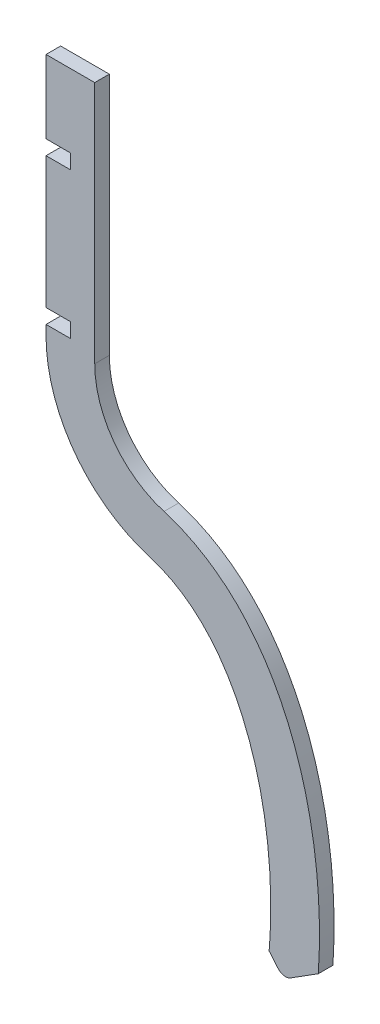
ISO-10303-21;
HEADER;
FILE_DESCRIPTION(('STEP AP214'),'2;1');
FILE_NAME('part.step','',(''),(''),'','','');
FILE_SCHEMA(('AUTOMOTIVE_DESIGN { 1 0 10303 214 1 1 1 1 }'));
ENDSEC;
DATA;
#1=APPLICATION_CONTEXT('core data for automotive mechanical design processes');
#2=APPLICATION_PROTOCOL_DEFINITION('international standard','automotive_design',2000,#1);
#3=PRODUCT_CONTEXT('',#1,'mechanical');
#4=PRODUCT('Part','Part','',(#3));
#5=PRODUCT_RELATED_PRODUCT_CATEGORY('part','',(#4));
#6=PRODUCT_DEFINITION_FORMATION('','',#4);
#7=PRODUCT_DEFINITION_CONTEXT('part definition',#1,'design');
#8=PRODUCT_DEFINITION('design','',#6,#7);
#9=PRODUCT_DEFINITION_SHAPE('','',#8);
#10=(LENGTH_UNIT() NAMED_UNIT(*) SI_UNIT(.MILLI.,.METRE.));
#11=(NAMED_UNIT(*) PLANE_ANGLE_UNIT() SI_UNIT($,.RADIAN.));
#12=(NAMED_UNIT(*) SI_UNIT($,.STERADIAN.) SOLID_ANGLE_UNIT());
#13=UNCERTAINTY_MEASURE_WITH_UNIT(LENGTH_MEASURE(1.E-05),#10,'distance_accuracy_value','');
#14=(GEOMETRIC_REPRESENTATION_CONTEXT(3) GLOBAL_UNCERTAINTY_ASSIGNED_CONTEXT((#13)) GLOBAL_UNIT_ASSIGNED_CONTEXT((#10,
#11,#12)) REPRESENTATION_CONTEXT('',''));
#15=CARTESIAN_POINT('',(0.,0.,0.));
#16=DIRECTION('',(0.,0.,1.));
#17=DIRECTION('',(1.,0.,0.));
#18=AXIS2_PLACEMENT_3D('',#15,#16,#17);
#19=CARTESIAN_POINT('',(30.2472330755642,111.105178128736,3.));
#20=DIRECTION('',(1.,0.,0.));
#21=DIRECTION('',(0.,1.,0.));
#22=AXIS2_PLACEMENT_3D('',#19,#20,#21);
#23=PLANE('',#22);
#24=DIRECTION('',(0.,0.,1.));
#25=VECTOR('',#24,1.);
#26=CARTESIAN_POINT('',(30.2472330755642,93.1051781287361,3.));
#27=LINE('',#26,#25);
#28=CARTESIAN_POINT('',(30.2472330755642,93.1051781287361,0.));
#29=VERTEX_POINT('',#28);
#30=CARTESIAN_POINT('',(30.2472330755642,93.1051781287361,3.));
#31=VERTEX_POINT('',#30);
#32=EDGE_CURVE('E251',#29,#31,#27,.T.);
#33=ORIENTED_EDGE('',*,*,#32,.F.);
#34=DIRECTION('',(0.,-1.,0.));
#35=VECTOR('',#34,1.);
#36=CARTESIAN_POINT('',(30.2472330755642,111.105178128736,0.));
#37=LINE('',#36,#35);
#38=CARTESIAN_POINT('',(30.2472330755642,66.1051781287361,0.));
#39=VERTEX_POINT('',#38);
#40=EDGE_CURVE('E352',#29,#39,#37,.T.);
#41=ORIENTED_EDGE('',*,*,#40,.T.);
#42=DIRECTION('',(0.,0.,1.));
#43=VECTOR('',#42,1.);
#44=CARTESIAN_POINT('',(30.2472330755642,66.1051781287361,3.));
#45=LINE('',#44,#43);
#46=CARTESIAN_POINT('',(30.2472330755642,66.1051781287361,3.));
#47=VERTEX_POINT('',#46);
#48=EDGE_CURVE('E246',#39,#47,#45,.T.);
#49=ORIENTED_EDGE('',*,*,#48,.T.);
#50=DIRECTION('',(0.,-1.,0.));
#51=VECTOR('',#50,1.);
#52=CARTESIAN_POINT('',(30.2472330755642,111.105178128736,3.));
#53=LINE('',#52,#51);
#54=EDGE_CURVE('E295',#31,#47,#53,.T.);
#55=ORIENTED_EDGE('',*,*,#54,.F.);
#56=EDGE_LOOP('',(#33,#41,#49,#55));
#57=FACE_BOUND('',#56,.T.);
#58=ADVANCED_FACE('F39',(#57),#23,.F.);
#59=DIRECTION('',(0.,0.,1.));
#60=VECTOR('',#59,1.);
#61=CARTESIAN_POINT('',(30.2472330755642,63.1051781287361,3.));
#62=LINE('',#61,#60);
#63=CARTESIAN_POINT('',(30.2472330755642,63.1051781287361,0.));
#64=VERTEX_POINT('',#63);
#65=CARTESIAN_POINT('',(30.2472330755642,63.1051781287361,3.));
#66=VERTEX_POINT('',#65);
#67=EDGE_CURVE('E218',#64,#66,#62,.T.);
#68=ORIENTED_EDGE('',*,*,#67,.F.);
#69=CARTESIAN_POINT('',(30.2472330755642,61.1051781287361,0.));
#70=VERTEX_POINT('',#69);
#71=EDGE_CURVE('E341',#64,#70,#37,.T.);
#72=ORIENTED_EDGE('',*,*,#71,.T.);
#73=DIRECTION('',(0.,0.,-1.));
#74=VECTOR('',#73,1.);
#75=CARTESIAN_POINT('',(30.2472330755642,61.1051781287361,3.));
#76=LINE('',#75,#74);
#77=CARTESIAN_POINT('',(30.2472330755642,61.1051781287361,3.));
#78=VERTEX_POINT('',#77);
#79=EDGE_CURVE('E393',#78,#70,#76,.T.);
#80=ORIENTED_EDGE('',*,*,#79,.F.);
#81=EDGE_CURVE('E289',#66,#78,#53,.T.);
#82=ORIENTED_EDGE('',*,*,#81,.F.);
#83=EDGE_LOOP('',(#68,#72,#80,#82));
#84=FACE_BOUND('',#83,.T.);
#85=ADVANCED_FACE('F325',(#84),#23,.F.);
#86=CARTESIAN_POINT('',(30.2472330755642,111.105178128736,3.));
#87=DIRECTION('',(0.,-1.,0.));
#88=DIRECTION('',(0.,0.,-1.));
#89=AXIS2_PLACEMENT_3D('',#86,#87,#88);
#90=PLANE('',#89);
#91=DIRECTION('',(-1.,0.,0.));
#92=VECTOR('',#91,1.);
#93=CARTESIAN_POINT('',(30.2472330755642,111.105178128736,0.));
#94=LINE('',#93,#92);
#95=CARTESIAN_POINT('',(40.2472330755642,111.105178128736,0.));
#96=VERTEX_POINT('',#95);
#97=CARTESIAN_POINT('',(30.2472330755642,111.105178128736,0.));
#98=VERTEX_POINT('',#97);
#99=EDGE_CURVE('E285',#96,#98,#94,.T.);
#100=ORIENTED_EDGE('',*,*,#99,.T.);
#101=DIRECTION('',(0.,0.,-1.));
#102=VECTOR('',#101,1.);
#103=CARTESIAN_POINT('',(30.2472330755642,111.105178128736,3.));
#104=LINE('',#103,#102);
#105=CARTESIAN_POINT('',(30.2472330755642,111.105178128736,3.));
#106=VERTEX_POINT('',#105);
#107=EDGE_CURVE('E395',#106,#98,#104,.T.);
#108=ORIENTED_EDGE('',*,*,#107,.F.);
#109=DIRECTION('',(-1.,0.,0.));
#110=VECTOR('',#109,1.);
#111=CARTESIAN_POINT('',(30.2472330755642,111.105178128736,3.));
#112=LINE('',#111,#110);
#113=CARTESIAN_POINT('',(40.2472330755642,111.105178128736,3.));
#114=VERTEX_POINT('',#113);
#115=EDGE_CURVE('E286',#114,#106,#112,.T.);
#116=ORIENTED_EDGE('',*,*,#115,.F.);
#117=DIRECTION('',(0.,0.,-1.));
#118=VECTOR('',#117,1.);
#119=CARTESIAN_POINT('',(40.2472330755642,111.105178128736,3.));
#120=LINE('',#119,#118);
#121=EDGE_CURVE('E381',#114,#96,#120,.T.);
#122=ORIENTED_EDGE('',*,*,#121,.T.);
#123=EDGE_LOOP('',(#100,#108,#116,#122));
#124=FACE_BOUND('',#123,.T.);
#125=ADVANCED_FACE('F41',(#124),#90,.F.);
#126=CARTESIAN_POINT('',(30.2472330755642,96.1051781287361,0.));
#127=VERTEX_POINT('',#126);
#128=EDGE_CURVE('E354',#98,#127,#37,.T.);
#129=ORIENTED_EDGE('',*,*,#128,.T.);
#130=DIRECTION('',(0.,0.,1.));
#131=VECTOR('',#130,1.);
#132=CARTESIAN_POINT('',(30.2472330755642,96.1051781287361,3.));
#133=LINE('',#132,#131);
#134=CARTESIAN_POINT('',(30.2472330755642,96.1051781287361,3.));
#135=VERTEX_POINT('',#134);
#136=EDGE_CURVE('E256',#127,#135,#133,.T.);
#137=ORIENTED_EDGE('',*,*,#136,.T.);
#138=EDGE_CURVE('E291',#106,#135,#53,.T.);
#139=ORIENTED_EDGE('',*,*,#138,.F.);
#140=ORIENTED_EDGE('',*,*,#107,.T.);
#141=EDGE_LOOP('',(#129,#137,#139,#140));
#142=FACE_BOUND('',#141,.T.);
#143=ADVANCED_FACE('F321',(#142),#23,.F.);
#144=CARTESIAN_POINT('',(60.2472330755642,61.1051781287361,3.));
#145=DIRECTION('',(0.,0.,-1.));
#146=DIRECTION('',(-1.,0.,0.));
#147=AXIS2_PLACEMENT_3D('',#144,#145,#146);
#148=CYLINDRICAL_SURFACE('',#147,30.);
#149=CARTESIAN_POINT('',(60.2472330755642,61.1051781287361,0.));
#150=DIRECTION('',(0.,0.,1.));
#151=DIRECTION('',(1.,0.,0.));
#152=AXIS2_PLACEMENT_3D('',#149,#150,#151);
#153=CIRCLE('',#152,30.);
#154=CARTESIAN_POINT('',(51.5783245461013,32.3849757459567,0.));
#155=VERTEX_POINT('',#154);
#156=EDGE_CURVE('E351',#70,#155,#153,.T.);
#157=ORIENTED_EDGE('',*,*,#156,.T.);
#158=DIRECTION('',(0.,0.,-1.));
#159=VECTOR('',#158,1.);
#160=CARTESIAN_POINT('',(51.5783245461013,32.3849757459567,3.));
#161=LINE('',#160,#159);
#162=CARTESIAN_POINT('',(51.5783245461013,32.3849757459567,3.));
#163=VERTEX_POINT('',#162);
#164=EDGE_CURVE('E391',#163,#155,#161,.T.);
#165=ORIENTED_EDGE('',*,*,#164,.F.);
#166=CARTESIAN_POINT('',(60.2472330755642,61.1051781287361,3.));
#167=DIRECTION('',(0.,0.,1.));
#168=DIRECTION('',(1.,0.,0.));
#169=AXIS2_PLACEMENT_3D('',#166,#167,#168);
#170=CIRCLE('',#169,30.);
#171=EDGE_CURVE('E294',#78,#163,#170,.T.);
#172=ORIENTED_EDGE('',*,*,#171,.F.);
#173=ORIENTED_EDGE('',*,*,#79,.T.);
#174=EDGE_LOOP('',(#157,#165,#172,#173));
#175=FACE_BOUND('',#174,.T.);
#176=ADVANCED_FACE('F317',(#175),#148,.T.);
#177=CARTESIAN_POINT('',(51.5783245461013,32.3849757459567,3.));
#178=CARTESIAN_POINT('',(52.4418237474786,32.1243370675715,3.));
#179=CARTESIAN_POINT('',(54.160244695127,31.5041732941851,3.));
#180=CARTESIAN_POINT('',(57.3068480949443,29.9703545295423,3.));
#181=CARTESIAN_POINT('',(60.9092601517179,27.4640028905668,3.));
#182=CARTESIAN_POINT('',(64.7789113425041,23.4878427324668,3.));
#183=CARTESIAN_POINT('',(69.3337224846496,16.8889121106159,3.));
#184=CARTESIAN_POINT('',(73.7131899847158,6.38380492162644,3.));
#185=CARTESIAN_POINT('',(76.4393028225739,-8.61752881826473,3.));
#186=CARTESIAN_POINT('',(76.5234079166854,-21.8927167166831,3.));
#187=CARTESIAN_POINT('',(75.3368048169374,-32.2481326739936,3.));
#188=CARTESIAN_POINT('',(73.8512799930039,-39.6983401019073,3.));
#189=CARTESIAN_POINT('',(71.8117544691769,-46.6469231762444,3.));
#190=CARTESIAN_POINT('',(69.6998429414444,-51.8638052622201,3.));
#191=CARTESIAN_POINT('',(67.8067562733463,-55.6012721850078,3.));
#192=CARTESIAN_POINT('',(66.2988758888052,-58.1660065714299,3.));
#193=CARTESIAN_POINT('',(64.9856806027951,-60.0849481600171,3.));
#194=CARTESIAN_POINT('',(63.9040927418651,-61.4887999643172,3.));
#195=CARTESIAN_POINT('',(63.3660237976318,-62.1329634196774,3.));
#196=CARTESIAN_POINT('',(63.0865626162944,-62.4536589435812,3.));
#197=B_SPLINE_CURVE_WITH_KNOTS('',3,(#177,#178,#179,#180,#181,#182,#183,#184,#185,#186,#187,
#188,#189,#190,#191,#192,#193,#194,#195,#196),.UNSPECIFIED.,.F.,.F.,(4,1,1,1,1,1,1,1,1,1,1,1,1,
1,1,1,1,4),(0.0736016129873298,0.102551562581476,0.131501512175622,0.189401411363914,
0.247301310552205,0.305201209740497,0.421001008117081,0.536800806493665,0.652600604870249,
0.710500504058541,0.768400403246832,0.826300302435124,0.884200201623416,0.913150151217562,
0.942100100811708,0.971050050405854,0.985525025202927,1.),.UNSPECIFIED.);
#198=DIRECTION('',(0.,0.,-1.));
#199=VECTOR('',#198,1.);
#200=SURFACE_OF_LINEAR_EXTRUSION('',#197,#199);
#201=CARTESIAN_POINT('',(51.5783245461013,32.3849757459567,0.));
#202=CARTESIAN_POINT('',(52.4418237474786,32.1243370675715,0.));
#203=CARTESIAN_POINT('',(54.160244695127,31.5041732941851,0.));
#204=CARTESIAN_POINT('',(57.3068480949443,29.9703545295423,0.));
#205=CARTESIAN_POINT('',(60.9092601517179,27.4640028905668,0.));
#206=CARTESIAN_POINT('',(64.7789113425041,23.4878427324668,0.));
#207=CARTESIAN_POINT('',(69.3337224846496,16.8889121106159,0.));
#208=CARTESIAN_POINT('',(73.7131899847158,6.38380492162644,0.));
#209=CARTESIAN_POINT('',(76.4393028225739,-8.61752881826473,0.));
#210=CARTESIAN_POINT('',(76.5234079166854,-21.8927167166831,0.));
#211=CARTESIAN_POINT('',(75.3368048169374,-32.2481326739936,0.));
#212=CARTESIAN_POINT('',(73.8512799930039,-39.6983401019073,0.));
#213=CARTESIAN_POINT('',(71.8117544691769,-46.6469231762444,0.));
#214=CARTESIAN_POINT('',(69.6998429414444,-51.8638052622201,0.));
#215=CARTESIAN_POINT('',(67.8067562733463,-55.6012721850078,0.));
#216=CARTESIAN_POINT('',(66.2988758888052,-58.1660065714299,0.));
#217=CARTESIAN_POINT('',(64.9856806027951,-60.0849481600171,0.));
#218=CARTESIAN_POINT('',(63.9040927418651,-61.4887999643172,0.));
#219=CARTESIAN_POINT('',(63.3660237976318,-62.1329634196774,0.));
#220=CARTESIAN_POINT('',(63.0865626162944,-62.4536589435812,0.));
#221=B_SPLINE_CURVE_WITH_KNOTS('',3,(#201,#202,#203,#204,#205,#206,#207,#208,#209,#210,#211,
#212,#213,#214,#215,#216,#217,#218,#219,#220),.UNSPECIFIED.,.F.,.F.,(4,1,1,1,1,1,1,1,1,1,1,1,1,
1,1,1,1,4),(0.0736016129873298,0.102551562581476,0.131501512175622,0.189401411363914,
0.247301310552205,0.305201209740497,0.421001008117081,0.536800806493665,0.652600604870249,
0.710500504058541,0.768400403246832,0.826300302435124,0.884200201623416,0.913150151217562,
0.942100100811708,0.971050050405854,0.985525025202927,1.),.UNSPECIFIED.);
#222=CARTESIAN_POINT('',(76.0488444966909,-25.3953063540741,0.));
#223=VERTEX_POINT('',#222);
#224=EDGE_CURVE('E360',#155,#223,#221,.T.);
#225=ORIENTED_EDGE('',*,*,#224,.T.);
#226=DIRECTION('',(0.,0.,-1.));
#227=VECTOR('',#226,1.);
#228=CARTESIAN_POINT('',(76.0488444966956,-25.3953063540795,3.));
#229=LINE('',#228,#227);
#230=CARTESIAN_POINT('',(76.0488444966909,-25.3953063540741,3.));
#231=VERTEX_POINT('',#230);
#232=EDGE_CURVE('E282',#223,#231,#229,.F.);
#233=ORIENTED_EDGE('',*,*,#232,.T.);
#234=EDGE_CURVE('E297',#163,#231,#197,.T.);
#235=ORIENTED_EDGE('',*,*,#234,.F.);
#236=ORIENTED_EDGE('',*,*,#164,.T.);
#237=EDGE_LOOP('',(#225,#233,#235,#236));
#238=FACE_BOUND('',#237,.T.);
#239=ADVANCED_FACE('F312',(#238),#200,.F.);
#240=CARTESIAN_POINT('',(70.6256816408782,-69.0234142155192,3.));
#241=CARTESIAN_POINT('',(94.0603865040222,-42.1309316258111,3.));
#242=CARTESIAN_POINT('',(93.4691575994557,30.1862516868117,3.));
#243=CARTESIAN_POINT('',(54.4679607225889,41.9583765402165,3.));
#244=B_SPLINE_CURVE_WITH_KNOTS('',3,(#240,#241,#242,#243),.UNSPECIFIED.,.F.,.F.,(4,4),
(0.0736016129873298,1.),.UNSPECIFIED.);
#245=DIRECTION('',(0.,0.,-1.));
#246=VECTOR('',#245,1.);
#247=SURFACE_OF_LINEAR_EXTRUSION('',#244,#246);
#248=CARTESIAN_POINT('',(86.1515531886918,-24.38839271404,3.));
#249=VERTEX_POINT('',#248);
#250=CARTESIAN_POINT('',(54.4679607225889,41.9583765402165,3.));
#251=VERTEX_POINT('',#250);
#252=EDGE_CURVE('E303',#249,#251,#244,.T.);
#253=ORIENTED_EDGE('',*,*,#252,.F.);
#254=DIRECTION('',(0.,0.,-1.));
#255=VECTOR('',#254,1.);
#256=CARTESIAN_POINT('',(86.1515531888008,-24.3883927139711,3.));
#257=LINE('',#256,#255);
#258=CARTESIAN_POINT('',(86.1515531886918,-24.38839271404,0.));
#259=VERTEX_POINT('',#258);
#260=EDGE_CURVE('E277',#249,#259,#257,.T.);
#261=ORIENTED_EDGE('',*,*,#260,.T.);
#262=CARTESIAN_POINT('',(70.6256816408782,-69.0234142155192,0.));
#263=CARTESIAN_POINT('',(94.0603865040222,-42.1309316258111,0.));
#264=CARTESIAN_POINT('',(93.4691575994557,30.1862516868117,0.));
#265=CARTESIAN_POINT('',(54.4679607225889,41.9583765402165,0.));
#266=B_SPLINE_CURVE_WITH_KNOTS('',3,(#262,#263,#264,#265),.UNSPECIFIED.,.F.,.F.,(4,4),
(0.0736016129873298,1.),.UNSPECIFIED.);
#267=CARTESIAN_POINT('',(54.4679607225889,41.9583765402165,0.));
#268=VERTEX_POINT('',#267);
#269=EDGE_CURVE('E364',#259,#268,#266,.T.);
#270=ORIENTED_EDGE('',*,*,#269,.T.);
#271=DIRECTION('',(0.,0.,-1.));
#272=VECTOR('',#271,1.);
#273=CARTESIAN_POINT('',(54.4679607225889,41.9583765402165,3.));
#274=LINE('',#273,#272);
#275=EDGE_CURVE('E388',#251,#268,#274,.T.);
#276=ORIENTED_EDGE('',*,*,#275,.F.);
#277=EDGE_LOOP('',(#253,#261,#270,#276));
#278=FACE_BOUND('',#277,.T.);
#279=ADVANCED_FACE('F316',(#278),#247,.F.);
#280=CARTESIAN_POINT('',(60.2472330755642,61.1051781287361,3.));
#281=DIRECTION('',(0.,0.,-1.));
#282=DIRECTION('',(-1.,0.,0.));
#283=AXIS2_PLACEMENT_3D('',#280,#281,#282);
#284=CYLINDRICAL_SURFACE('',#283,20.);
#285=CARTESIAN_POINT('',(60.2472330755642,61.1051781287361,0.));
#286=DIRECTION('',(0.,0.,-1.));
#287=DIRECTION('',(1.,0.,0.));
#288=AXIS2_PLACEMENT_3D('',#285,#286,#287);
#289=CIRCLE('',#288,20.);
#290=CARTESIAN_POINT('',(40.2472330755642,61.1051781287361,0.));
#291=VERTEX_POINT('',#290);
#292=EDGE_CURVE('E375',#268,#291,#289,.T.);
#293=ORIENTED_EDGE('',*,*,#292,.T.);
#294=DIRECTION('',(0.,0.,-1.));
#295=VECTOR('',#294,1.);
#296=CARTESIAN_POINT('',(40.2472330755642,61.1051781287361,3.));
#297=LINE('',#296,#295);
#298=CARTESIAN_POINT('',(40.2472330755642,61.1051781287361,3.));
#299=VERTEX_POINT('',#298);
#300=EDGE_CURVE('E384',#299,#291,#297,.T.);
#301=ORIENTED_EDGE('',*,*,#300,.F.);
#302=CARTESIAN_POINT('',(60.2472330755642,61.1051781287361,3.));
#303=DIRECTION('',(0.,0.,-1.));
#304=DIRECTION('',(1.,0.,0.));
#305=AXIS2_PLACEMENT_3D('',#302,#303,#304);
#306=CIRCLE('',#305,20.);
#307=EDGE_CURVE('E442',#251,#299,#306,.T.);
#308=ORIENTED_EDGE('',*,*,#307,.F.);
#309=ORIENTED_EDGE('',*,*,#275,.T.);
#310=EDGE_LOOP('',(#293,#301,#308,#309));
#311=FACE_BOUND('',#310,.T.);
#312=ADVANCED_FACE('F440',(#311),#284,.F.);
#313=CARTESIAN_POINT('',(40.2472330755642,111.105178128736,3.));
#314=DIRECTION('',(-1.,0.,0.));
#315=DIRECTION('',(0.,-1.,0.));
#316=AXIS2_PLACEMENT_3D('',#313,#314,#315);
#317=PLANE('',#316);
#318=DIRECTION('',(0.,1.,0.));
#319=VECTOR('',#318,1.);
#320=CARTESIAN_POINT('',(40.2472330755642,111.105178128736,0.));
#321=LINE('',#320,#319);
#322=EDGE_CURVE('E290',#291,#96,#321,.T.);
#323=ORIENTED_EDGE('',*,*,#322,.T.);
#324=ORIENTED_EDGE('',*,*,#121,.F.);
#325=DIRECTION('',(0.,1.,0.));
#326=VECTOR('',#325,1.);
#327=CARTESIAN_POINT('',(40.2472330755642,111.105178128736,3.));
#328=LINE('',#327,#326);
#329=EDGE_CURVE('E385',#299,#114,#328,.T.);
#330=ORIENTED_EDGE('',*,*,#329,.F.);
#331=ORIENTED_EDGE('',*,*,#300,.T.);
#332=EDGE_LOOP('',(#323,#324,#330,#331));
#333=FACE_BOUND('',#332,.T.);
#334=ADVANCED_FACE('F449',(#333),#317,.F.);
#335=CARTESIAN_POINT('',(60.2472330755642,61.1051781287361,3.));
#336=DIRECTION('',(0.,0.,1.));
#337=DIRECTION('',(1.,0.,0.));
#338=AXIS2_PLACEMENT_3D('',#335,#336,#337);
#339=PLANE('',#338);
#340=DIRECTION('',(-1.,0.,0.));
#341=VECTOR('',#340,1.);
#342=CARTESIAN_POINT('',(60.2472330755642,96.1051781287361,3.));
#343=LINE('',#342,#341);
#344=CARTESIAN_POINT('',(35.2472330755643,96.1051781287361,3.00000000000034));
#345=VERTEX_POINT('',#344);
#346=EDGE_CURVE('E259',#345,#135,#343,.T.);
#347=ORIENTED_EDGE('',*,*,#346,.F.);
#348=DIRECTION('',(0.,1.,0.));
#349=VECTOR('',#348,1.);
#350=CARTESIAN_POINT('',(35.2472330755643,93.1041781287361,3.00000000000034));
#351=LINE('',#350,#349);
#352=CARTESIAN_POINT('',(35.2472330755643,93.1051781287361,3.00000000000034));
#353=VERTEX_POINT('',#352);
#354=EDGE_CURVE('E199',#353,#345,#351,.T.);
#355=ORIENTED_EDGE('',*,*,#354,.F.);
#356=DIRECTION('',(-1.,0.,0.));
#357=VECTOR('',#356,1.);
#358=CARTESIAN_POINT('',(60.2472330755642,93.1051781287361,3.));
#359=LINE('',#358,#357);
#360=EDGE_CURVE('E253',#353,#31,#359,.T.);
#361=ORIENTED_EDGE('',*,*,#360,.T.);
#362=ORIENTED_EDGE('',*,*,#54,.T.);
#363=DIRECTION('',(-1.,0.,0.));
#364=VECTOR('',#363,1.);
#365=CARTESIAN_POINT('',(60.2472330755642,66.1051781287361,3.));
#366=LINE('',#365,#364);
#367=CARTESIAN_POINT('',(35.2472330755642,66.1051781287361,3.00000000000001));
#368=VERTEX_POINT('',#367);
#369=EDGE_CURVE('E249',#368,#47,#366,.T.);
#370=ORIENTED_EDGE('',*,*,#369,.F.);
#371=DIRECTION('',(0.,1.,0.));
#372=VECTOR('',#371,1.);
#373=CARTESIAN_POINT('',(35.2472330755642,63.1041781287361,3.00000000000001));
#374=LINE('',#373,#372);
#375=CARTESIAN_POINT('',(35.2472330755642,63.1051781287361,3.00000000000001));
#376=VERTEX_POINT('',#375);
#377=EDGE_CURVE('E232',#376,#368,#374,.T.);
#378=ORIENTED_EDGE('',*,*,#377,.F.);
#379=DIRECTION('',(-1.,0.,0.));
#380=VECTOR('',#379,1.);
#381=CARTESIAN_POINT('',(60.2472330755642,63.1051781287361,3.));
#382=LINE('',#381,#380);
#383=EDGE_CURVE('E243',#376,#66,#382,.T.);
#384=ORIENTED_EDGE('',*,*,#383,.T.);
#385=ORIENTED_EDGE('',*,*,#81,.T.);
#386=ORIENTED_EDGE('',*,*,#171,.T.);
#387=ORIENTED_EDGE('',*,*,#234,.T.);
#388=DIRECTION('',(-0.644870939209569,0.764291483508071,0.));
#389=VECTOR('',#388,1.);
#390=CARTESIAN_POINT('',(72.6750956175646,-21.3967891639962,3.));
#391=LINE('',#390,#389);
#392=CARTESIAN_POINT('',(77.8831884325907,-27.5693436114379,3.));
#393=VERTEX_POINT('',#392);
#394=EDGE_CURVE('E266',#393,#231,#391,.T.);
#395=ORIENTED_EDGE('',*,*,#394,.F.);
#396=CARTESIAN_POINT('',(79.4117713996068,-26.2796017330188,3.));
#397=DIRECTION('',(0.,0.,-1.));
#398=DIRECTION('',(1.,0.,0.));
#399=AXIS2_PLACEMENT_3D('',#396,#397,#398);
#400=CIRCLE('',#399,2.);
#401=CARTESIAN_POINT('',(80.4797573823835,-27.9705795390802,3.));
#402=VERTEX_POINT('',#401);
#403=EDGE_CURVE('E271',#402,#393,#400,.T.);
#404=ORIENTED_EDGE('',*,*,#403,.F.);
#405=DIRECTION('',(-0.845488903030735,-0.533992991388355,0.));
#406=VECTOR('',#405,1.);
#407=CARTESIAN_POINT('',(80.4797573823835,-27.9705795390802,3.));
#408=LINE('',#407,#406);
#409=EDGE_CURVE('E261',#249,#402,#408,.T.);
#410=ORIENTED_EDGE('',*,*,#409,.F.);
#411=ORIENTED_EDGE('',*,*,#252,.T.);
#412=ORIENTED_EDGE('',*,*,#307,.T.);
#413=ORIENTED_EDGE('',*,*,#329,.T.);
#414=ORIENTED_EDGE('',*,*,#115,.T.);
#415=ORIENTED_EDGE('',*,*,#138,.T.);
#416=EDGE_LOOP('',(#347,#355,#361,#362,#370,#378,#384,#385,#386,#387,#395,#404,#410,#411,#412,
#413,#414,#415));
#417=FACE_BOUND('',#416,.T.);
#418=ADVANCED_FACE('F417',(#417),#339,.T.);
#419=CARTESIAN_POINT('',(60.2472330755642,61.1051781287361,0.));
#420=DIRECTION('',(0.,0.,1.));
#421=DIRECTION('',(1.,0.,0.));
#422=AXIS2_PLACEMENT_3D('',#419,#420,#421);
#423=PLANE('',#422);
#424=DIRECTION('',(0.,-1.,0.));
#425=VECTOR('',#424,1.);
#426=CARTESIAN_POINT('',(40.2152202653166,96.1051781287361,0.));
#427=LINE('',#426,#425);
#428=CARTESIAN_POINT('',(40.2152202653166,96.1051781287361,0.));
#429=VERTEX_POINT('',#428);
#430=CARTESIAN_POINT('',(40.2152202653166,93.1051781287361,0.));
#431=VERTEX_POINT('',#430);
#432=EDGE_CURVE('E47',#429,#431,#427,.T.);
#433=ORIENTED_EDGE('',*,*,#432,.F.);
#434=DIRECTION('',(-1.,0.,0.));
#435=VECTOR('',#434,1.);
#436=CARTESIAN_POINT('',(60.2472330755642,96.1051781287361,0.));
#437=LINE('',#436,#435);
#438=EDGE_CURVE('E11',#429,#127,#437,.T.);
#439=ORIENTED_EDGE('',*,*,#438,.T.);
#440=ORIENTED_EDGE('',*,*,#128,.F.);
#441=ORIENTED_EDGE('',*,*,#99,.F.);
#442=ORIENTED_EDGE('',*,*,#322,.F.);
#443=ORIENTED_EDGE('',*,*,#292,.F.);
#444=ORIENTED_EDGE('',*,*,#269,.F.);
#445=DIRECTION('',(-0.845488903030735,-0.533992991388355,0.));
#446=VECTOR('',#445,1.);
#447=CARTESIAN_POINT('',(106.232889013102,-11.7054437722946,0.));
#448=LINE('',#447,#446);
#449=CARTESIAN_POINT('',(80.4797573823835,-27.9705795390802,0.));
#450=VERTEX_POINT('',#449);
#451=EDGE_CURVE('E397',#259,#450,#448,.T.);
#452=ORIENTED_EDGE('',*,*,#451,.T.);
#453=CARTESIAN_POINT('',(79.4117713996068,-26.2796017330188,0.));
#454=DIRECTION('',(0.,0.,-1.));
#455=DIRECTION('',(1.,0.,0.));
#456=AXIS2_PLACEMENT_3D('',#453,#454,#455);
#457=CIRCLE('',#456,2.);
#458=CARTESIAN_POINT('',(77.8831884325907,-27.5693436114379,0.));
#459=VERTEX_POINT('',#458);
#460=EDGE_CURVE('E262',#450,#459,#457,.T.);
#461=ORIENTED_EDGE('',*,*,#460,.T.);
#462=DIRECTION('',(-0.644870939209569,0.764291483508071,0.));
#463=VECTOR('',#462,1.);
#464=CARTESIAN_POINT('',(72.6750956175646,-21.3967891639962,0.));
#465=LINE('',#464,#463);
#466=EDGE_CURVE('E265',#459,#223,#465,.T.);
#467=ORIENTED_EDGE('',*,*,#466,.T.);
#468=ORIENTED_EDGE('',*,*,#224,.F.);
#469=ORIENTED_EDGE('',*,*,#156,.F.);
#470=ORIENTED_EDGE('',*,*,#71,.F.);
#471=DIRECTION('',(-1.,0.,0.));
#472=VECTOR('',#471,1.);
#473=CARTESIAN_POINT('',(60.2472330755642,63.1051781287361,0.));
#474=LINE('',#473,#472);
#475=CARTESIAN_POINT('',(40.2152202653165,63.1051781287361,0.));
#476=VERTEX_POINT('',#475);
#477=EDGE_CURVE('E349',#476,#64,#474,.T.);
#478=ORIENTED_EDGE('',*,*,#477,.F.);
#479=DIRECTION('',(0.,-1.,0.));
#480=VECTOR('',#479,1.);
#481=CARTESIAN_POINT('',(40.2152202653165,66.1051781287361,0.));
#482=LINE('',#481,#480);
#483=CARTESIAN_POINT('',(40.2152202653165,66.1051781287361,0.));
#484=VERTEX_POINT('',#483);
#485=EDGE_CURVE('E401',#484,#476,#482,.T.);
#486=ORIENTED_EDGE('',*,*,#485,.F.);
#487=DIRECTION('',(-1.,0.,0.));
#488=VECTOR('',#487,1.);
#489=CARTESIAN_POINT('',(60.2472330755642,66.1051781287361,0.));
#490=LINE('',#489,#488);
#491=EDGE_CURVE('E403',#484,#39,#490,.T.);
#492=ORIENTED_EDGE('',*,*,#491,.T.);
#493=ORIENTED_EDGE('',*,*,#40,.F.);
#494=DIRECTION('',(-1.,0.,0.));
#495=VECTOR('',#494,1.);
#496=CARTESIAN_POINT('',(60.2472330755642,93.1051781287361,0.));
#497=LINE('',#496,#495);
#498=EDGE_CURVE('E406',#431,#29,#497,.T.);
#499=ORIENTED_EDGE('',*,*,#498,.F.);
#500=EDGE_LOOP('',(#433,#439,#440,#441,#442,#443,#444,#452,#461,#467,#468,#469,#470,#478,#486,
#492,#493,#499));
#501=FACE_BOUND('',#500,.T.);
#502=ADVANCED_FACE('F347',(#501),#423,.F.);
#503=CARTESIAN_POINT('',(72.6750956175646,-21.3967891639962,0.));
#504=DIRECTION('',(0.764291483508071,0.644870939209569,0.));
#505=DIRECTION('',(-0.644870939209569,0.764291483508071,0.));
#506=AXIS2_PLACEMENT_3D('',#503,#504,#505);
#507=PLANE('',#506);
#508=ORIENTED_EDGE('',*,*,#466,.F.);
#509=DIRECTION('',(0.,0.,1.));
#510=VECTOR('',#509,1.);
#511=CARTESIAN_POINT('',(77.8831884325907,-27.5693436114379,0.));
#512=LINE('',#511,#510);
#513=EDGE_CURVE('E275',#459,#393,#512,.T.);
#514=ORIENTED_EDGE('',*,*,#513,.T.);
#515=ORIENTED_EDGE('',*,*,#394,.T.);
#516=ORIENTED_EDGE('',*,*,#232,.F.);
#517=EDGE_LOOP('',(#508,#514,#515,#516));
#518=FACE_BOUND('',#517,.T.);
#519=ADVANCED_FACE('F426',(#518),#507,.F.);
#520=CARTESIAN_POINT('',(80.4797573823835,-27.9705795390802,0.));
#521=DIRECTION('',(-0.533992991388355,0.845488903030735,0.));
#522=DIRECTION('',(-0.845488903030735,-0.533992991388355,0.));
#523=AXIS2_PLACEMENT_3D('',#520,#521,#522);
#524=PLANE('',#523);
#525=ORIENTED_EDGE('',*,*,#409,.T.);
#526=DIRECTION('',(0.,0.,1.));
#527=VECTOR('',#526,1.);
#528=CARTESIAN_POINT('',(80.4797573823835,-27.9705795390802,0.));
#529=LINE('',#528,#527);
#530=EDGE_CURVE('E269',#450,#402,#529,.T.);
#531=ORIENTED_EDGE('',*,*,#530,.F.);
#532=ORIENTED_EDGE('',*,*,#451,.F.);
#533=ORIENTED_EDGE('',*,*,#260,.F.);
#534=EDGE_LOOP('',(#525,#531,#532,#533));
#535=FACE_BOUND('',#534,.T.);
#536=ADVANCED_FACE('F431',(#535),#524,.F.);
#537=CARTESIAN_POINT('',(79.4117713996068,-26.2796017330188,0.));
#538=DIRECTION('',(0.,0.,1.));
#539=DIRECTION('',(1.,0.,0.));
#540=AXIS2_PLACEMENT_3D('',#537,#538,#539);
#541=CYLINDRICAL_SURFACE('',#540,2.);
#542=ORIENTED_EDGE('',*,*,#403,.T.);
#543=ORIENTED_EDGE('',*,*,#513,.F.);
#544=ORIENTED_EDGE('',*,*,#460,.F.);
#545=ORIENTED_EDGE('',*,*,#530,.T.);
#546=EDGE_LOOP('',(#542,#543,#544,#545));
#547=FACE_BOUND('',#546,.T.);
#548=ADVANCED_FACE('F428',(#547),#541,.T.);
#549=CARTESIAN_POINT('',(0.247233075567913,66.1051781287361,1.60000000002818));
#550=DIRECTION('',(0.,-1.,0.));
#551=DIRECTION('',(-0.939692620785908,0.,0.342020143325669));
#552=AXIS2_PLACEMENT_3D('',#549,#550,#551);
#553=CYLINDRICAL_SURFACE('',#552,40.);
#554=ORIENTED_EDGE('',*,*,#485,.T.);
#555=CARTESIAN_POINT('',(0.247233075567913,63.1051781287361,1.60000000002818));
#556=DIRECTION('',(0.,1.,0.));
#557=DIRECTION('',(0.939692620785908,0.,-0.342020143325669));
#558=AXIS2_PLACEMENT_3D('',#555,#556,#557);
#559=CIRCLE('',#558,40.);
#560=CARTESIAN_POINT('',(40.2227255678427,63.1051781287361,0.200000000000007));
#561=VERTEX_POINT('',#560);
#562=EDGE_CURVE('E62',#561,#476,#559,.T.);
#563=ORIENTED_EDGE('',*,*,#562,.F.);
#564=DIRECTION('',(0.,-1.,0.));
#565=VECTOR('',#564,1.);
#566=CARTESIAN_POINT('',(40.2227255678428,66.1051781287361,0.200000000000007));
#567=LINE('',#566,#565);
#568=CARTESIAN_POINT('',(40.2227255678428,66.1051781287361,0.200000000000007));
#569=VERTEX_POINT('',#568);
#570=EDGE_CURVE('E220',#561,#569,#567,.F.);
#571=ORIENTED_EDGE('',*,*,#570,.T.);
#572=CARTESIAN_POINT('',(0.247233075567913,66.1051781287361,1.60000000002818));
#573=DIRECTION('',(0.,1.,0.));
#574=DIRECTION('',(0.939692620785908,0.,-0.342020143325669));
#575=AXIS2_PLACEMENT_3D('',#572,#573,#574);
#576=CIRCLE('',#575,40.);
#577=EDGE_CURVE('E237',#569,#484,#576,.T.);
#578=ORIENTED_EDGE('',*,*,#577,.T.);
#579=EDGE_LOOP('',(#554,#563,#571,#578));
#580=FACE_BOUND('',#579,.T.);
#581=ADVANCED_FACE('F466',(#580),#553,.F.);
#582=CARTESIAN_POINT('',(0.247233075567913,66.1051781287361,1.60000000002818));
#583=DIRECTION('',(0.,1.,0.));
#584=DIRECTION('',(0.939692620785908,0.,-0.342020143325669));
#585=AXIS2_PLACEMENT_3D('',#582,#583,#584);
#586=PLANE('',#585);
#587=ORIENTED_EDGE('',*,*,#369,.T.);
#588=ORIENTED_EDGE('',*,*,#48,.F.);
#589=ORIENTED_EDGE('',*,*,#491,.F.);
#590=ORIENTED_EDGE('',*,*,#577,.F.);
#591=DIRECTION('',(-1.,0.,0.));
#592=VECTOR('',#591,1.);
#593=CARTESIAN_POINT('',(40.2472330755642,66.1051781287361,0.200000000000009));
#594=LINE('',#593,#592);
#595=CARTESIAN_POINT('',(35.2472330755642,66.1051781287361,0.200000000000009));
#596=VERTEX_POINT('',#595);
#597=EDGE_CURVE('E225',#569,#596,#594,.T.);
#598=ORIENTED_EDGE('',*,*,#597,.T.);
#599=DIRECTION('',(0.,0.,1.));
#600=VECTOR('',#599,1.);
#601=CARTESIAN_POINT('',(35.2472330755642,66.1051781287361,3.00000000000001));
#602=LINE('',#601,#600);
#603=EDGE_CURVE('E228',#596,#368,#602,.T.);
#604=ORIENTED_EDGE('',*,*,#603,.T.);
#605=EDGE_LOOP('',(#587,#588,#589,#590,#598,#604));
#606=FACE_BOUND('',#605,.T.);
#607=ADVANCED_FACE('F471',(#606),#586,.F.);
#608=CARTESIAN_POINT('',(0.247233075567913,63.1051781287361,1.60000000002818));
#609=DIRECTION('',(0.,1.,0.));
#610=DIRECTION('',(0.939692620785908,0.,-0.342020143325669));
#611=AXIS2_PLACEMENT_3D('',#608,#609,#610);
#612=PLANE('',#611);
#613=DIRECTION('',(0.,0.,-1.));
#614=VECTOR('',#613,1.);
#615=CARTESIAN_POINT('',(35.2472330755642,63.1051781287361,3.00000000000001));
#616=LINE('',#615,#614);
#617=CARTESIAN_POINT('',(35.2472330755642,63.1051781287361,0.200000000000009));
#618=VERTEX_POINT('',#617);
#619=EDGE_CURVE('E222',#376,#618,#616,.T.);
#620=ORIENTED_EDGE('',*,*,#619,.T.);
#621=DIRECTION('',(1.,0.,0.));
#622=VECTOR('',#621,1.);
#623=CARTESIAN_POINT('',(40.2472330755642,63.1051781287361,0.200000000000009));
#624=LINE('',#623,#622);
#625=EDGE_CURVE('E234',#618,#561,#624,.T.);
#626=ORIENTED_EDGE('',*,*,#625,.T.);
#627=ORIENTED_EDGE('',*,*,#562,.T.);
#628=ORIENTED_EDGE('',*,*,#477,.T.);
#629=ORIENTED_EDGE('',*,*,#67,.T.);
#630=ORIENTED_EDGE('',*,*,#383,.F.);
#631=EDGE_LOOP('',(#620,#626,#627,#628,#629,#630));
#632=FACE_BOUND('',#631,.T.);
#633=ADVANCED_FACE('F473',(#632),#612,.T.);
#634=CARTESIAN_POINT('',(35.2472330755642,63.1041781287361,3.00000000000001));
#635=DIRECTION('',(-1.,0.,0.));
#636=DIRECTION('',(0.,0.,1.));
#637=AXIS2_PLACEMENT_3D('',#634,#635,#636);
#638=PLANE('',#637);
#639=ORIENTED_EDGE('',*,*,#619,.F.);
#640=ORIENTED_EDGE('',*,*,#377,.T.);
#641=ORIENTED_EDGE('',*,*,#603,.F.);
#642=DIRECTION('',(0.,1.,0.));
#643=VECTOR('',#642,1.);
#644=CARTESIAN_POINT('',(35.2472330755642,63.1041781287361,0.200000000000009));
#645=LINE('',#644,#643);
#646=EDGE_CURVE('E231',#618,#596,#645,.T.);
#647=ORIENTED_EDGE('',*,*,#646,.F.);
#648=EDGE_LOOP('',(#639,#640,#641,#647));
#649=FACE_BOUND('',#648,.T.);
#650=ADVANCED_FACE('F476',(#649),#638,.T.);
#651=CARTESIAN_POINT('',(40.2472330755642,63.1041781287361,0.200000000000009));
#652=DIRECTION('',(0.,0.,-1.));
#653=DIRECTION('',(-1.,0.,0.));
#654=AXIS2_PLACEMENT_3D('',#651,#652,#653);
#655=PLANE('',#654);
#656=ORIENTED_EDGE('',*,*,#625,.F.);
#657=ORIENTED_EDGE('',*,*,#646,.T.);
#658=ORIENTED_EDGE('',*,*,#597,.F.);
#659=ORIENTED_EDGE('',*,*,#570,.F.);
#660=EDGE_LOOP('',(#656,#657,#658,#659));
#661=FACE_BOUND('',#660,.T.);
#662=ADVANCED_FACE('F480',(#661),#655,.T.);
#663=CARTESIAN_POINT('',(0.247233075568037,96.1051781287361,1.60000000002851));
#664=DIRECTION('',(0.,-1.,0.));
#665=DIRECTION('',(-0.939692620785908,0.,0.342020143325669));
#666=AXIS2_PLACEMENT_3D('',#663,#664,#665);
#667=CYLINDRICAL_SURFACE('',#666,40.);
#668=ORIENTED_EDGE('',*,*,#432,.T.);
#669=CARTESIAN_POINT('',(0.247233075568037,93.1051781287361,1.60000000002851));
#670=DIRECTION('',(0.,1.,0.));
#671=DIRECTION('',(0.939692620785908,0.,-0.342020143325669));
#672=AXIS2_PLACEMENT_3D('',#669,#670,#671);
#673=CIRCLE('',#672,40.);
#674=CARTESIAN_POINT('',(40.2227255678429,93.1051781287361,0.200000000000334));
#675=VERTEX_POINT('',#674);
#676=EDGE_CURVE('E54',#675,#431,#673,.T.);
#677=ORIENTED_EDGE('',*,*,#676,.F.);
#678=DIRECTION('',(0.,-1.,0.));
#679=VECTOR('',#678,1.);
#680=CARTESIAN_POINT('',(40.2227255678429,96.1051781287361,0.200000000000334));
#681=LINE('',#680,#679);
#682=CARTESIAN_POINT('',(40.2227255678429,96.1051781287361,0.200000000000334));
#683=VERTEX_POINT('',#682);
#684=EDGE_CURVE('E240',#675,#683,#681,.F.);
#685=ORIENTED_EDGE('',*,*,#684,.T.);
#686=CARTESIAN_POINT('',(0.247233075568037,96.1051781287361,1.60000000002851));
#687=DIRECTION('',(0.,1.,0.));
#688=DIRECTION('',(0.939692620785908,0.,-0.342020143325669));
#689=AXIS2_PLACEMENT_3D('',#686,#687,#688);
#690=CIRCLE('',#689,40.);
#691=EDGE_CURVE('E207',#683,#429,#690,.T.);
#692=ORIENTED_EDGE('',*,*,#691,.T.);
#693=EDGE_LOOP('',(#668,#677,#685,#692));
#694=FACE_BOUND('',#693,.T.);
#695=ADVANCED_FACE('F409',(#694),#667,.F.);
#696=CARTESIAN_POINT('',(0.247233075568037,96.1051781287361,1.60000000002851));
#697=DIRECTION('',(0.,1.,0.));
#698=DIRECTION('',(0.939692620785908,0.,-0.342020143325669));
#699=AXIS2_PLACEMENT_3D('',#696,#697,#698);
#700=PLANE('',#699);
#701=ORIENTED_EDGE('',*,*,#346,.T.);
#702=ORIENTED_EDGE('',*,*,#136,.F.);
#703=ORIENTED_EDGE('',*,*,#438,.F.);
#704=ORIENTED_EDGE('',*,*,#691,.F.);
#705=DIRECTION('',(-1.,0.,0.));
#706=VECTOR('',#705,1.);
#707=CARTESIAN_POINT('',(40.2472330755643,96.1051781287361,0.200000000000335));
#708=LINE('',#707,#706);
#709=CARTESIAN_POINT('',(35.2472330755643,96.1051781287361,0.200000000000335));
#710=VERTEX_POINT('',#709);
#711=EDGE_CURVE('E192',#683,#710,#708,.T.);
#712=ORIENTED_EDGE('',*,*,#711,.T.);
#713=DIRECTION('',(0.,0.,1.));
#714=VECTOR('',#713,1.);
#715=CARTESIAN_POINT('',(35.2472330755643,96.1051781287361,3.00000000000034));
#716=LINE('',#715,#714);
#717=EDGE_CURVE('E200',#710,#345,#716,.T.);
#718=ORIENTED_EDGE('',*,*,#717,.T.);
#719=EDGE_LOOP('',(#701,#702,#703,#704,#712,#718));
#720=FACE_BOUND('',#719,.T.);
#721=ADVANCED_FACE('F204',(#720),#700,.F.);
#722=CARTESIAN_POINT('',(0.247233075568037,93.1051781287361,1.60000000002851));
#723=DIRECTION('',(0.,1.,0.));
#724=DIRECTION('',(0.939692620785908,0.,-0.342020143325669));
#725=AXIS2_PLACEMENT_3D('',#722,#723,#724);
#726=PLANE('',#725);
#727=DIRECTION('',(0.,0.,-1.));
#728=VECTOR('',#727,1.);
#729=CARTESIAN_POINT('',(35.2472330755643,93.1051781287361,3.00000000000034));
#730=LINE('',#729,#728);
#731=CARTESIAN_POINT('',(35.2472330755643,93.1051781287361,0.200000000000335));
#732=VERTEX_POINT('',#731);
#733=EDGE_CURVE('E208',#353,#732,#730,.T.);
#734=ORIENTED_EDGE('',*,*,#733,.T.);
#735=DIRECTION('',(1.,0.,0.));
#736=VECTOR('',#735,1.);
#737=CARTESIAN_POINT('',(40.2472330755643,93.1051781287361,0.200000000000335));
#738=LINE('',#737,#736);
#739=EDGE_CURVE('E194',#732,#675,#738,.T.);
#740=ORIENTED_EDGE('',*,*,#739,.T.);
#741=ORIENTED_EDGE('',*,*,#676,.T.);
#742=ORIENTED_EDGE('',*,*,#498,.T.);
#743=ORIENTED_EDGE('',*,*,#32,.T.);
#744=ORIENTED_EDGE('',*,*,#360,.F.);
#745=EDGE_LOOP('',(#734,#740,#741,#742,#743,#744));
#746=FACE_BOUND('',#745,.T.);
#747=ADVANCED_FACE('F412',(#746),#726,.T.);
#748=CARTESIAN_POINT('',(35.2472330755643,93.1041781287361,3.00000000000034));
#749=DIRECTION('',(-1.,0.,0.));
#750=DIRECTION('',(0.,0.,1.));
#751=AXIS2_PLACEMENT_3D('',#748,#749,#750);
#752=PLANE('',#751);
#753=ORIENTED_EDGE('',*,*,#733,.F.);
#754=ORIENTED_EDGE('',*,*,#354,.T.);
#755=ORIENTED_EDGE('',*,*,#717,.F.);
#756=DIRECTION('',(0.,1.,0.));
#757=VECTOR('',#756,1.);
#758=CARTESIAN_POINT('',(35.2472330755643,93.1041781287361,0.200000000000335));
#759=LINE('',#758,#757);
#760=EDGE_CURVE('E188',#732,#710,#759,.T.);
#761=ORIENTED_EDGE('',*,*,#760,.F.);
#762=EDGE_LOOP('',(#753,#754,#755,#761));
#763=FACE_BOUND('',#762,.T.);
#764=ADVANCED_FACE('F210',(#763),#752,.T.);
#765=CARTESIAN_POINT('',(40.2472330755643,93.1041781287361,0.200000000000335));
#766=DIRECTION('',(0.,0.,-1.));
#767=DIRECTION('',(-1.,0.,0.));
#768=AXIS2_PLACEMENT_3D('',#765,#766,#767);
#769=PLANE('',#768);
#770=ORIENTED_EDGE('',*,*,#739,.F.);
#771=ORIENTED_EDGE('',*,*,#760,.T.);
#772=ORIENTED_EDGE('',*,*,#711,.F.);
#773=ORIENTED_EDGE('',*,*,#684,.F.);
#774=EDGE_LOOP('',(#770,#771,#772,#773));
#775=FACE_BOUND('',#774,.T.);
#776=ADVANCED_FACE('F190',(#775),#769,.T.);
#777=CLOSED_SHELL('',(#58,#85,#125,#143,#176,#239,#279,#312,#334,#418,#502,#519,#536,#548,#581,
#607,#633,#650,#662,#695,#721,#747,#764,#776));
#778=MANIFOLD_SOLID_BREP('B2',#777);
#779=ADVANCED_BREP_SHAPE_REPRESENTATION('',(#18,#778),#14);
#780=SHAPE_DEFINITION_REPRESENTATION(#9,#779);
ENDSEC;
END-ISO-10303-21;
